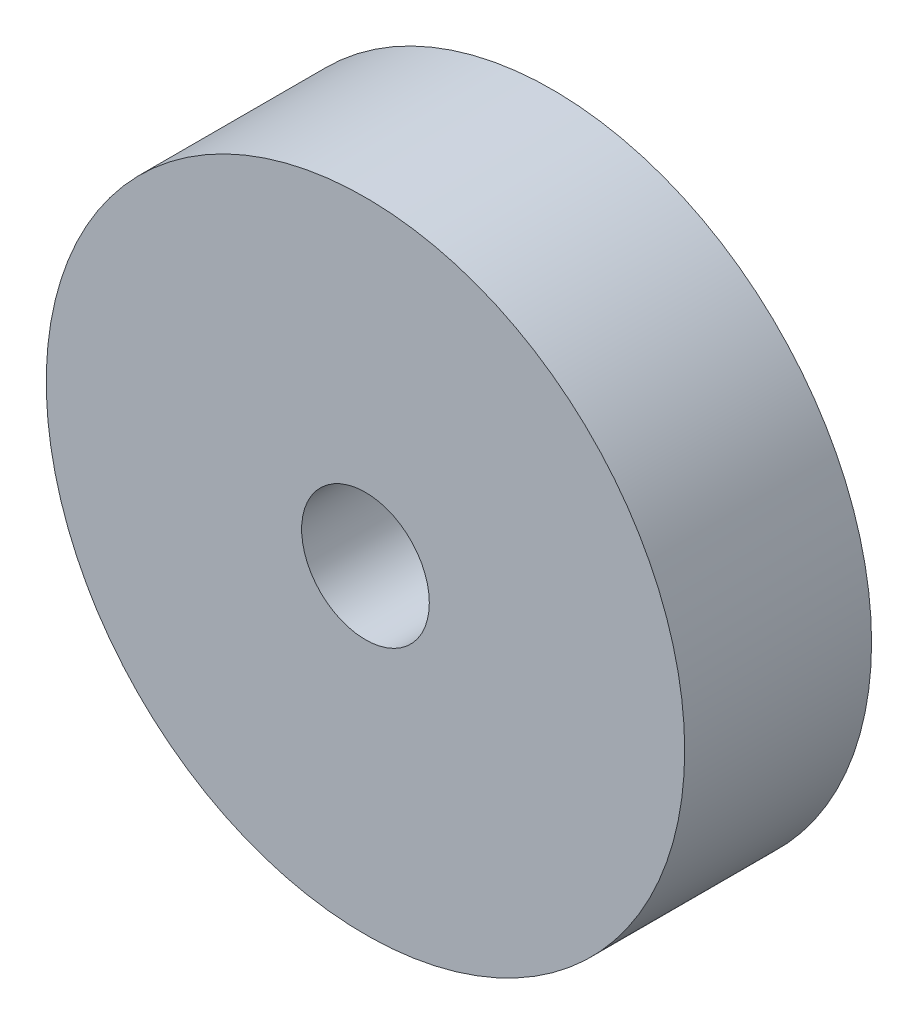
ISO-10303-21;
HEADER;
FILE_DESCRIPTION(('STEP AP214'),'2;1');
FILE_NAME('part.step','',(''),(''),'','','');
FILE_SCHEMA(('AUTOMOTIVE_DESIGN { 1 0 10303 214 1 1 1 1 }'));
ENDSEC;
DATA;
#1=APPLICATION_CONTEXT('core data for automotive mechanical design processes');
#2=APPLICATION_PROTOCOL_DEFINITION('international standard','automotive_design',2000,#1);
#3=PRODUCT_CONTEXT('',#1,'mechanical');
#4=PRODUCT('Part','Part','',(#3));
#5=PRODUCT_RELATED_PRODUCT_CATEGORY('part','',(#4));
#6=PRODUCT_DEFINITION_FORMATION('','',#4);
#7=PRODUCT_DEFINITION_CONTEXT('part definition',#1,'design');
#8=PRODUCT_DEFINITION('design','',#6,#7);
#9=PRODUCT_DEFINITION_SHAPE('','',#8);
#10=(LENGTH_UNIT() NAMED_UNIT(*) SI_UNIT(.MILLI.,.METRE.));
#11=(NAMED_UNIT(*) PLANE_ANGLE_UNIT() SI_UNIT($,.RADIAN.));
#12=(NAMED_UNIT(*) SI_UNIT($,.STERADIAN.) SOLID_ANGLE_UNIT());
#13=UNCERTAINTY_MEASURE_WITH_UNIT(LENGTH_MEASURE(1.E-05),#10,'distance_accuracy_value','');
#14=(GEOMETRIC_REPRESENTATION_CONTEXT(3) GLOBAL_UNCERTAINTY_ASSIGNED_CONTEXT((#13)) GLOBAL_UNIT_ASSIGNED_CONTEXT((#10,
#11,#12)) REPRESENTATION_CONTEXT('',''));
#15=CARTESIAN_POINT('',(0.,0.,0.));
#16=DIRECTION('',(0.,0.,1.));
#17=DIRECTION('',(1.,0.,0.));
#18=AXIS2_PLACEMENT_3D('',#15,#16,#17);
#19=CARTESIAN_POINT('',(0.,0.,12.));
#20=DIRECTION('',(0.,0.,1.));
#21=DIRECTION('',(1.,0.,0.));
#22=AXIS2_PLACEMENT_3D('',#19,#20,#21);
#23=PLANE('',#22);
#24=CARTESIAN_POINT('',(0.,0.,12.));
#25=DIRECTION('',(0.,0.,1.));
#26=DIRECTION('',(1.,0.,0.));
#27=AXIS2_PLACEMENT_3D('',#24,#25,#26);
#28=CIRCLE('',#27,20.5);
#29=CARTESIAN_POINT('',(20.5,0.,12.));
#30=VERTEX_POINT('',#29);
#31=EDGE_CURVE('E10',#30,#30,#28,.T.);
#32=ORIENTED_EDGE('',*,*,#31,.T.);
#33=EDGE_LOOP('',(#32));
#34=FACE_BOUND('',#33,.T.);
#35=CARTESIAN_POINT('',(0.,0.,12.));
#36=DIRECTION('',(0.,0.,1.));
#37=DIRECTION('',(1.,0.,0.));
#38=AXIS2_PLACEMENT_3D('',#35,#36,#37);
#39=CIRCLE('',#38,4.1);
#40=CARTESIAN_POINT('',(4.1,0.,12.));
#41=VERTEX_POINT('',#40);
#42=EDGE_CURVE('E42',#41,#41,#39,.T.);
#43=ORIENTED_EDGE('',*,*,#42,.F.);
#44=EDGE_LOOP('',(#43));
#45=FACE_BOUND('',#44,.T.);
#46=ADVANCED_FACE('F31',(#34,#45),#23,.T.);
#47=CARTESIAN_POINT('',(0.,0.,0.));
#48=DIRECTION('',(0.,0.,1.));
#49=DIRECTION('',(1.,0.,0.));
#50=AXIS2_PLACEMENT_3D('',#47,#48,#49);
#51=PLANE('',#50);
#52=CARTESIAN_POINT('',(0.,0.,0.));
#53=DIRECTION('',(0.,0.,1.));
#54=DIRECTION('',(1.,0.,0.));
#55=AXIS2_PLACEMENT_3D('',#52,#53,#54);
#56=CIRCLE('',#55,20.5);
#57=CARTESIAN_POINT('',(20.5,0.,0.));
#58=VERTEX_POINT('',#57);
#59=EDGE_CURVE('E35',#58,#58,#56,.T.);
#60=ORIENTED_EDGE('',*,*,#59,.F.);
#61=EDGE_LOOP('',(#60));
#62=FACE_BOUND('',#61,.T.);
#63=CARTESIAN_POINT('',(0.,0.,0.));
#64=DIRECTION('',(0.,0.,1.));
#65=DIRECTION('',(1.,0.,0.));
#66=AXIS2_PLACEMENT_3D('',#63,#64,#65);
#67=CIRCLE('',#66,4.1);
#68=CARTESIAN_POINT('',(4.1,0.,0.));
#69=VERTEX_POINT('',#68);
#70=EDGE_CURVE('E44',#69,#69,#67,.T.);
#71=ORIENTED_EDGE('',*,*,#70,.T.);
#72=EDGE_LOOP('',(#71));
#73=FACE_BOUND('',#72,.T.);
#74=ADVANCED_FACE('F54',(#62,#73),#51,.F.);
#75=CARTESIAN_POINT('',(0.,0.,12.));
#76=DIRECTION('',(0.,0.,-1.));
#77=DIRECTION('',(-1.,0.,0.));
#78=AXIS2_PLACEMENT_3D('',#75,#76,#77);
#79=CYLINDRICAL_SURFACE('',#78,20.5);
#80=ORIENTED_EDGE('',*,*,#31,.F.);
#81=EDGE_LOOP('',(#80));
#82=FACE_BOUND('',#81,.T.);
#83=ORIENTED_EDGE('',*,*,#59,.T.);
#84=EDGE_LOOP('',(#83));
#85=FACE_BOUND('',#84,.T.);
#86=ADVANCED_FACE('F33',(#82,#85),#79,.T.);
#87=CARTESIAN_POINT('',(0.,0.,12.));
#88=DIRECTION('',(0.,0.,-1.));
#89=DIRECTION('',(-1.,0.,0.));
#90=AXIS2_PLACEMENT_3D('',#87,#88,#89);
#91=CYLINDRICAL_SURFACE('',#90,4.1);
#92=ORIENTED_EDGE('',*,*,#42,.T.);
#93=EDGE_LOOP('',(#92));
#94=FACE_BOUND('',#93,.T.);
#95=ORIENTED_EDGE('',*,*,#70,.F.);
#96=EDGE_LOOP('',(#95));
#97=FACE_BOUND('',#96,.T.);
#98=ADVANCED_FACE('F50',(#94,#97),#91,.F.);
#99=CLOSED_SHELL('',(#46,#74,#86,#98));
#100=MANIFOLD_SOLID_BREP('B2',#99);
#101=ADVANCED_BREP_SHAPE_REPRESENTATION('',(#18,#100),#14);
#102=SHAPE_DEFINITION_REPRESENTATION(#9,#101);
ENDSEC;
END-ISO-10303-21;
